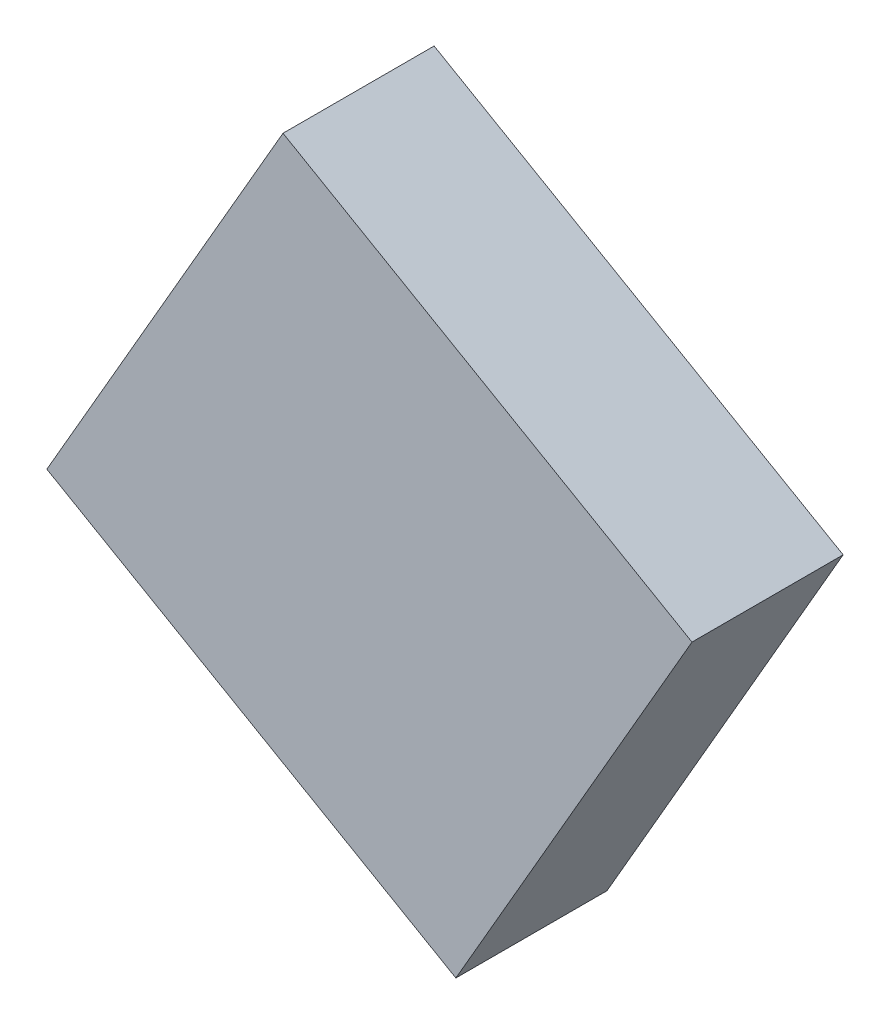
ISO-10303-21;
HEADER;
FILE_DESCRIPTION(('STEP AP214'),'2;1');
FILE_NAME('part.step','',(''),(''),'','','');
FILE_SCHEMA(('AUTOMOTIVE_DESIGN { 1 0 10303 214 1 1 1 1 }'));
ENDSEC;
DATA;
#1=APPLICATION_CONTEXT('core data for automotive mechanical design processes');
#2=APPLICATION_PROTOCOL_DEFINITION('international standard','automotive_design',2000,#1);
#3=PRODUCT_CONTEXT('',#1,'mechanical');
#4=PRODUCT('Part','Part','',(#3));
#5=PRODUCT_RELATED_PRODUCT_CATEGORY('part','',(#4));
#6=PRODUCT_DEFINITION_FORMATION('','',#4);
#7=PRODUCT_DEFINITION_CONTEXT('part definition',#1,'design');
#8=PRODUCT_DEFINITION('design','',#6,#7);
#9=PRODUCT_DEFINITION_SHAPE('','',#8);
#10=(LENGTH_UNIT() NAMED_UNIT(*) SI_UNIT(.MILLI.,.METRE.));
#11=(NAMED_UNIT(*) PLANE_ANGLE_UNIT() SI_UNIT($,.RADIAN.));
#12=(NAMED_UNIT(*) SI_UNIT($,.STERADIAN.) SOLID_ANGLE_UNIT());
#13=UNCERTAINTY_MEASURE_WITH_UNIT(LENGTH_MEASURE(1.E-05),#10,'distance_accuracy_value','');
#14=(GEOMETRIC_REPRESENTATION_CONTEXT(3) GLOBAL_UNCERTAINTY_ASSIGNED_CONTEXT((#13)) GLOBAL_UNIT_ASSIGNED_CONTEXT((#10,
#11,#12)) REPRESENTATION_CONTEXT('',''));
#15=CARTESIAN_POINT('',(0.,0.,0.));
#16=DIRECTION('',(0.,0.,1.));
#17=DIRECTION('',(1.,0.,0.));
#18=AXIS2_PLACEMENT_3D('',#15,#16,#17);
#19=CARTESIAN_POINT('',(3.41506048,0.91504262,1.59999934));
#20=DIRECTION('',(0.,0.,1.));
#21=DIRECTION('',(1.,0.,0.));
#22=AXIS2_PLACEMENT_3D('',#19,#20,#21);
#23=PLANE('',#22);
#24=DIRECTION('',(0.866022661097392,-0.500004750443226,0.));
#25=VECTOR('',#24,1.);
#26=CARTESIAN_POINT('',(0.91504262,-3.41506048,1.59999934));
#27=LINE('',#26,#25);
#28=CARTESIAN_POINT('',(0.915042619999841,-3.41506047999991,1.59999934));
#29=VERTEX_POINT('',#28);
#30=CARTESIAN_POINT('',(-3.41506047999991,-0.915042619999841,1.59999934));
#31=VERTEX_POINT('',#30);
#32=EDGE_CURVE('E53',#29,#31,#27,.F.);
#33=ORIENTED_EDGE('',*,*,#32,.F.);
#34=DIRECTION('',(0.500004750443226,0.866022661097392,0.));
#35=VECTOR('',#34,1.);
#36=CARTESIAN_POINT('',(3.41506048,0.91504262,1.59999934));
#37=LINE('',#36,#35);
#38=CARTESIAN_POINT('',(3.41506047999982,0.915042619999682,1.59999934));
#39=VERTEX_POINT('',#38);
#40=EDGE_CURVE('E68',#39,#29,#37,.F.);
#41=ORIENTED_EDGE('',*,*,#40,.F.);
#42=DIRECTION('',(-0.866022661097392,0.500004750443226,0.));
#43=VECTOR('',#42,1.);
#44=CARTESIAN_POINT('',(-0.91504262,3.41506048,1.59999934));
#45=LINE('',#44,#43);
#46=CARTESIAN_POINT('',(-0.915042619999841,3.41506047999991,1.59999934));
#47=VERTEX_POINT('',#46);
#48=EDGE_CURVE('E20',#47,#39,#45,.F.);
#49=ORIENTED_EDGE('',*,*,#48,.F.);
#50=DIRECTION('',(-0.500004750443226,-0.866022661097392,0.));
#51=VECTOR('',#50,1.);
#52=CARTESIAN_POINT('',(-3.41506048,-0.91504262,1.59999934));
#53=LINE('',#52,#51);
#54=EDGE_CURVE('E58',#31,#47,#53,.F.);
#55=ORIENTED_EDGE('',*,*,#54,.F.);
#56=EDGE_LOOP('',(#33,#41,#49,#55));
#57=FACE_BOUND('',#56,.T.);
#58=ADVANCED_FACE('F17',(#57),#23,.T.);
#59=CARTESIAN_POINT('',(-0.91504262,3.41506048,0.));
#60=DIRECTION('',(0.500004750443226,0.866022661097392,0.));
#61=DIRECTION('',(-0.866022661097392,0.500004750443226,0.));
#62=AXIS2_PLACEMENT_3D('',#59,#60,#61);
#63=PLANE('',#62);
#64=DIRECTION('',(0.,0.,1.));
#65=VECTOR('',#64,1.);
#66=CARTESIAN_POINT('',(3.41506048,0.91504262,0.));
#67=LINE('',#66,#65);
#68=CARTESIAN_POINT('',(3.41506047999982,0.915042619999682,0.));
#69=VERTEX_POINT('',#68);
#70=EDGE_CURVE('E79',#69,#39,#67,.T.);
#71=ORIENTED_EDGE('',*,*,#70,.F.);
#72=DIRECTION('',(-0.866022661097465,0.500004750443099,0.));
#73=VECTOR('',#72,1.);
#74=CARTESIAN_POINT('',(3.41506048,0.91504262,0.));
#75=LINE('',#74,#73);
#76=CARTESIAN_POINT('',(-0.915042619999841,3.41506047999991,0.));
#77=VERTEX_POINT('',#76);
#78=EDGE_CURVE('E74',#69,#77,#75,.T.);
#79=ORIENTED_EDGE('',*,*,#78,.T.);
#80=DIRECTION('',(0.,0.,1.));
#81=VECTOR('',#80,1.);
#82=CARTESIAN_POINT('',(-0.915042619999364,3.41506047999963,0.));
#83=LINE('',#82,#81);
#84=EDGE_CURVE('E63',#47,#77,#83,.F.);
#85=ORIENTED_EDGE('',*,*,#84,.F.);
#86=ORIENTED_EDGE('',*,*,#48,.T.);
#87=EDGE_LOOP('',(#71,#79,#85,#86));
#88=FACE_BOUND('',#87,.T.);
#89=ADVANCED_FACE('F73',(#88),#63,.T.);
#90=CARTESIAN_POINT('',(-3.41506048,-0.91504262,0.));
#91=DIRECTION('',(-0.866022661097392,0.500004750443226,0.));
#92=DIRECTION('',(-0.500004750443226,-0.866022661097392,0.));
#93=AXIS2_PLACEMENT_3D('',#90,#91,#92);
#94=PLANE('',#93);
#95=ORIENTED_EDGE('',*,*,#84,.T.);
#96=DIRECTION('',(-0.500004750443099,-0.866022661097465,0.));
#97=VECTOR('',#96,1.);
#98=CARTESIAN_POINT('',(-0.91504262,3.41506048,0.));
#99=LINE('',#98,#97);
#100=CARTESIAN_POINT('',(-3.41506047999991,-0.915042619999841,0.));
#101=VERTEX_POINT('',#100);
#102=EDGE_CURVE('E84',#77,#101,#99,.T.);
#103=ORIENTED_EDGE('',*,*,#102,.T.);
#104=DIRECTION('',(0.,0.,1.));
#105=VECTOR('',#104,1.);
#106=CARTESIAN_POINT('',(-3.41506047999963,-0.915042619999364,0.));
#107=LINE('',#106,#105);
#108=EDGE_CURVE('E65',#31,#101,#107,.F.);
#109=ORIENTED_EDGE('',*,*,#108,.F.);
#110=ORIENTED_EDGE('',*,*,#54,.T.);
#111=EDGE_LOOP('',(#95,#103,#109,#110));
#112=FACE_BOUND('',#111,.T.);
#113=ADVANCED_FACE('F60',(#112),#94,.T.);
#114=CARTESIAN_POINT('',(0.91504262,-3.41506048,0.));
#115=DIRECTION('',(-0.500004750443226,-0.866022661097392,0.));
#116=DIRECTION('',(0.866022661097392,-0.500004750443226,0.));
#117=AXIS2_PLACEMENT_3D('',#114,#115,#116);
#118=PLANE('',#117);
#119=ORIENTED_EDGE('',*,*,#108,.T.);
#120=DIRECTION('',(0.866022661097465,-0.500004750443099,0.));
#121=VECTOR('',#120,1.);
#122=CARTESIAN_POINT('',(-3.41506048,-0.91504262,0.));
#123=LINE('',#122,#121);
#124=CARTESIAN_POINT('',(0.915042619999841,-3.41506047999991,0.));
#125=VERTEX_POINT('',#124);
#126=EDGE_CURVE('E26',#101,#125,#123,.T.);
#127=ORIENTED_EDGE('',*,*,#126,.T.);
#128=DIRECTION('',(0.,0.,1.));
#129=VECTOR('',#128,1.);
#130=CARTESIAN_POINT('',(0.915042619999364,-3.41506047999963,0.));
#131=LINE('',#130,#129);
#132=EDGE_CURVE('E34',#29,#125,#131,.F.);
#133=ORIENTED_EDGE('',*,*,#132,.F.);
#134=ORIENTED_EDGE('',*,*,#32,.T.);
#135=EDGE_LOOP('',(#119,#127,#133,#134));
#136=FACE_BOUND('',#135,.T.);
#137=ADVANCED_FACE('F88',(#136),#118,.T.);
#138=CARTESIAN_POINT('',(3.41506048,0.91504262,0.));
#139=DIRECTION('',(0.866022661097392,-0.500004750443226,0.));
#140=DIRECTION('',(0.500004750443226,0.866022661097392,0.));
#141=AXIS2_PLACEMENT_3D('',#138,#139,#140);
#142=PLANE('',#141);
#143=ORIENTED_EDGE('',*,*,#132,.T.);
#144=DIRECTION('',(0.500004750443099,0.866022661097465,0.));
#145=VECTOR('',#144,1.);
#146=CARTESIAN_POINT('',(0.91504262,-3.41506048,0.));
#147=LINE('',#146,#145);
#148=EDGE_CURVE('E11',#125,#69,#147,.T.);
#149=ORIENTED_EDGE('',*,*,#148,.T.);
#150=ORIENTED_EDGE('',*,*,#70,.T.);
#151=ORIENTED_EDGE('',*,*,#40,.T.);
#152=EDGE_LOOP('',(#143,#149,#150,#151));
#153=FACE_BOUND('',#152,.T.);
#154=ADVANCED_FACE('F91',(#153),#142,.T.);
#155=CARTESIAN_POINT('',(3.41506048,0.91504262,0.));
#156=DIRECTION('',(0.,0.,1.));
#157=DIRECTION('',(1.,0.,0.));
#158=AXIS2_PLACEMENT_3D('',#155,#156,#157);
#159=PLANE('',#158);
#160=ORIENTED_EDGE('',*,*,#126,.F.);
#161=ORIENTED_EDGE('',*,*,#102,.F.);
#162=ORIENTED_EDGE('',*,*,#78,.F.);
#163=ORIENTED_EDGE('',*,*,#148,.F.);
#164=EDGE_LOOP('',(#160,#161,#162,#163));
#165=FACE_BOUND('',#164,.T.);
#166=ADVANCED_FACE('F90',(#165),#159,.F.);
#167=CLOSED_SHELL('',(#58,#89,#113,#137,#154,#166));
#168=MANIFOLD_SOLID_BREP('B1',#167);
#169=ADVANCED_BREP_SHAPE_REPRESENTATION('',(#18,#168),#14);
#170=SHAPE_DEFINITION_REPRESENTATION(#9,#169);
ENDSEC;
END-ISO-10303-21;
